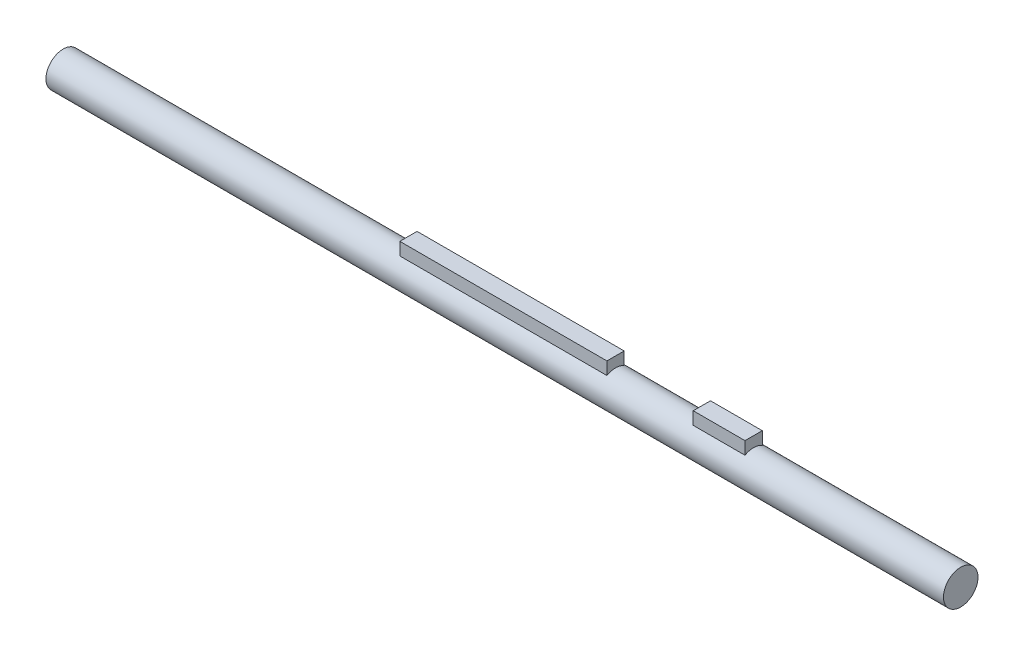
ISO-10303-21;
HEADER;
FILE_DESCRIPTION(('STEP AP214'),'2;1');
FILE_NAME('part.step','',(''),(''),'','','');
FILE_SCHEMA(('AUTOMOTIVE_DESIGN { 1 0 10303 214 1 1 1 1 }'));
ENDSEC;
DATA;
#1=APPLICATION_CONTEXT('core data for automotive mechanical design processes');
#2=APPLICATION_PROTOCOL_DEFINITION('international standard','automotive_design',2000,#1);
#3=PRODUCT_CONTEXT('',#1,'mechanical');
#4=PRODUCT('Part','Part','',(#3));
#5=PRODUCT_RELATED_PRODUCT_CATEGORY('part','',(#4));
#6=PRODUCT_DEFINITION_FORMATION('','',#4);
#7=PRODUCT_DEFINITION_CONTEXT('part definition',#1,'design');
#8=PRODUCT_DEFINITION('design','',#6,#7);
#9=PRODUCT_DEFINITION_SHAPE('','',#8);
#10=(LENGTH_UNIT() NAMED_UNIT(*) SI_UNIT(.MILLI.,.METRE.));
#11=(NAMED_UNIT(*) PLANE_ANGLE_UNIT() SI_UNIT($,.RADIAN.));
#12=(NAMED_UNIT(*) SI_UNIT($,.STERADIAN.) SOLID_ANGLE_UNIT());
#13=UNCERTAINTY_MEASURE_WITH_UNIT(LENGTH_MEASURE(1.E-05),#10,'distance_accuracy_value','');
#14=(GEOMETRIC_REPRESENTATION_CONTEXT(3) GLOBAL_UNCERTAINTY_ASSIGNED_CONTEXT((#13)) GLOBAL_UNIT_ASSIGNED_CONTEXT((#10,
#11,#12)) REPRESENTATION_CONTEXT('',''));
#15=CARTESIAN_POINT('',(0.,0.,0.));
#16=DIRECTION('',(0.,0.,1.));
#17=DIRECTION('',(1.,0.,0.));
#18=AXIS2_PLACEMENT_3D('',#15,#16,#17);
#19=CARTESIAN_POINT('',(-30.,8.,-2.5));
#20=DIRECTION('',(0.,0.,-1.));
#21=DIRECTION('',(0.,1.,0.));
#22=AXIS2_PLACEMENT_3D('',#19,#20,#21);
#23=PLANE('',#22);
#24=DIRECTION('',(1.,0.,0.));
#25=VECTOR('',#24,1.);
#26=CARTESIAN_POINT('',(-30.,8.,-2.5));
#27=LINE('',#26,#25);
#28=CARTESIAN_POINT('',(-30.,8.,-2.5));
#29=VERTEX_POINT('',#28);
#30=CARTESIAN_POINT('',(30.,8.,-2.5));
#31=VERTEX_POINT('',#30);
#32=EDGE_CURVE('E191',#29,#31,#27,.T.);
#33=ORIENTED_EDGE('',*,*,#32,.T.);
#34=DIRECTION('',(0.,-1.,0.));
#35=VECTOR('',#34,1.);
#36=CARTESIAN_POINT('',(30.,4.33012701892219,-2.5));
#37=LINE('',#36,#35);
#38=CARTESIAN_POINT('',(30.,4.33012701892219,-2.5));
#39=VERTEX_POINT('',#38);
#40=EDGE_CURVE('E177',#31,#39,#37,.T.);
#41=ORIENTED_EDGE('',*,*,#40,.T.);
#42=DIRECTION('',(1.,0.,0.));
#43=VECTOR('',#42,1.);
#44=CARTESIAN_POINT('',(-130.,4.33012701892219,-2.5));
#45=LINE('',#44,#43);
#46=CARTESIAN_POINT('',(-30.,4.33012701892219,-2.5));
#47=VERTEX_POINT('',#46);
#48=EDGE_CURVE('E71',#39,#47,#45,.F.);
#49=ORIENTED_EDGE('',*,*,#48,.T.);
#50=DIRECTION('',(0.,1.,0.));
#51=VECTOR('',#50,1.);
#52=CARTESIAN_POINT('',(-30.,8.,-2.5));
#53=LINE('',#52,#51);
#54=EDGE_CURVE('E180',#47,#29,#53,.T.);
#55=ORIENTED_EDGE('',*,*,#54,.T.);
#56=EDGE_LOOP('',(#33,#41,#49,#55));
#57=FACE_BOUND('',#56,.T.);
#58=ADVANCED_FACE('F47',(#57),#23,.T.);
#59=CARTESIAN_POINT('',(-30.,8.,2.5));
#60=DIRECTION('',(0.,0.,1.));
#61=DIRECTION('',(0.,-1.,0.));
#62=AXIS2_PLACEMENT_3D('',#59,#60,#61);
#63=PLANE('',#62);
#64=DIRECTION('',(1.,0.,0.));
#65=VECTOR('',#64,1.);
#66=CARTESIAN_POINT('',(-130.,4.33012701892219,2.5));
#67=LINE('',#66,#65);
#68=CARTESIAN_POINT('',(-30.,4.33012701892219,2.5));
#69=VERTEX_POINT('',#68);
#70=CARTESIAN_POINT('',(30.,4.33012701892219,2.5));
#71=VERTEX_POINT('',#70);
#72=EDGE_CURVE('E196',#69,#71,#67,.T.);
#73=ORIENTED_EDGE('',*,*,#72,.T.);
#74=DIRECTION('',(0.,1.,0.));
#75=VECTOR('',#74,1.);
#76=CARTESIAN_POINT('',(30.,8.,2.5));
#77=LINE('',#76,#75);
#78=CARTESIAN_POINT('',(30.,8.,2.5));
#79=VERTEX_POINT('',#78);
#80=EDGE_CURVE('E170',#71,#79,#77,.T.);
#81=ORIENTED_EDGE('',*,*,#80,.T.);
#82=DIRECTION('',(1.,0.,0.));
#83=VECTOR('',#82,1.);
#84=CARTESIAN_POINT('',(-30.,8.,2.5));
#85=LINE('',#84,#83);
#86=CARTESIAN_POINT('',(-30.,8.,2.5));
#87=VERTEX_POINT('',#86);
#88=EDGE_CURVE('E192',#87,#79,#85,.T.);
#89=ORIENTED_EDGE('',*,*,#88,.F.);
#90=DIRECTION('',(0.,-1.,0.));
#91=VECTOR('',#90,1.);
#92=CARTESIAN_POINT('',(-30.,8.,2.5));
#93=LINE('',#92,#91);
#94=EDGE_CURVE('E187',#87,#69,#93,.T.);
#95=ORIENTED_EDGE('',*,*,#94,.T.);
#96=EDGE_LOOP('',(#73,#81,#89,#95));
#97=FACE_BOUND('',#96,.T.);
#98=ADVANCED_FACE('F225',(#97),#63,.T.);
#99=CARTESIAN_POINT('',(-30.,8.,2.5));
#100=DIRECTION('',(0.,1.,0.));
#101=DIRECTION('',(0.,0.,1.));
#102=AXIS2_PLACEMENT_3D('',#99,#100,#101);
#103=PLANE('',#102);
#104=ORIENTED_EDGE('',*,*,#88,.T.);
#105=DIRECTION('',(0.,0.,-1.));
#106=VECTOR('',#105,1.);
#107=CARTESIAN_POINT('',(30.,8.,-2.5));
#108=LINE('',#107,#106);
#109=EDGE_CURVE('E136',#79,#31,#108,.T.);
#110=ORIENTED_EDGE('',*,*,#109,.T.);
#111=ORIENTED_EDGE('',*,*,#32,.F.);
#112=DIRECTION('',(0.,0.,1.));
#113=VECTOR('',#112,1.);
#114=CARTESIAN_POINT('',(-30.,8.,2.5));
#115=LINE('',#114,#113);
#116=EDGE_CURVE('E183',#29,#87,#115,.T.);
#117=ORIENTED_EDGE('',*,*,#116,.T.);
#118=EDGE_LOOP('',(#104,#110,#111,#117));
#119=FACE_BOUND('',#118,.T.);
#120=ADVANCED_FACE('F223',(#119),#103,.T.);
#121=CARTESIAN_POINT('',(-130.,0.,0.));
#122=DIRECTION('',(1.,0.,0.));
#123=DIRECTION('',(0.,0.,-1.));
#124=AXIS2_PLACEMENT_3D('',#121,#122,#123);
#125=CYLINDRICAL_SURFACE('',#124,5.);
#126=CARTESIAN_POINT('',(70.,0.,0.));
#127=DIRECTION('',(1.,0.,0.));
#128=DIRECTION('',(0.,0.,-1.));
#129=AXIS2_PLACEMENT_3D('',#126,#127,#128);
#130=CIRCLE('',#129,5.);
#131=CARTESIAN_POINT('',(70.,4.33012701892219,2.5));
#132=VERTEX_POINT('',#131);
#133=CARTESIAN_POINT('',(70.,4.33012701892219,-2.5));
#134=VERTEX_POINT('',#133);
#135=EDGE_CURVE('E117',#132,#134,#130,.F.);
#136=ORIENTED_EDGE('',*,*,#135,.F.);
#137=DIRECTION('',(-1.,0.,0.));
#138=VECTOR('',#137,1.);
#139=CARTESIAN_POINT('',(70.,4.33012701892219,2.5));
#140=LINE('',#139,#138);
#141=CARTESIAN_POINT('',(55.,4.33012701892219,2.5));
#142=VERTEX_POINT('',#141);
#143=EDGE_CURVE('E129',#132,#142,#140,.T.);
#144=ORIENTED_EDGE('',*,*,#143,.T.);
#145=CARTESIAN_POINT('',(55.,0.,0.));
#146=DIRECTION('',(1.,0.,0.));
#147=DIRECTION('',(0.,0.,-1.));
#148=AXIS2_PLACEMENT_3D('',#145,#146,#147);
#149=CIRCLE('',#148,5.);
#150=CARTESIAN_POINT('',(55.,4.33012701892219,-2.5));
#151=VERTEX_POINT('',#150);
#152=EDGE_CURVE('E152',#142,#151,#149,.F.);
#153=ORIENTED_EDGE('',*,*,#152,.T.);
#154=DIRECTION('',(-1.,0.,0.));
#155=VECTOR('',#154,1.);
#156=CARTESIAN_POINT('',(70.,4.33012701892219,-2.5));
#157=LINE('',#156,#155);
#158=EDGE_CURVE('E137',#134,#151,#157,.T.);
#159=ORIENTED_EDGE('',*,*,#158,.F.);
#160=EDGE_LOOP('',(#136,#144,#153,#159));
#161=FACE_BOUND('',#160,.T.);
#162=ORIENTED_EDGE('',*,*,#48,.F.);
#163=CARTESIAN_POINT('',(30.,0.,0.));
#164=DIRECTION('',(1.,0.,0.));
#165=DIRECTION('',(0.,0.,-1.));
#166=AXIS2_PLACEMENT_3D('',#163,#164,#165);
#167=CIRCLE('',#166,5.);
#168=EDGE_CURVE('E174',#39,#71,#167,.T.);
#169=ORIENTED_EDGE('',*,*,#168,.T.);
#170=ORIENTED_EDGE('',*,*,#72,.F.);
#171=CARTESIAN_POINT('',(-30.,0.,0.));
#172=DIRECTION('',(1.,0.,0.));
#173=DIRECTION('',(0.,0.,-1.));
#174=AXIS2_PLACEMENT_3D('',#171,#172,#173);
#175=CIRCLE('',#174,5.);
#176=EDGE_CURVE('E12',#69,#47,#175,.F.);
#177=ORIENTED_EDGE('',*,*,#176,.T.);
#178=EDGE_LOOP('',(#162,#169,#170,#177));
#179=FACE_BOUND('',#178,.T.);
#180=CARTESIAN_POINT('',(130.,0.,0.));
#181=DIRECTION('',(1.,0.,0.));
#182=DIRECTION('',(0.,0.,-1.));
#183=AXIS2_PLACEMENT_3D('',#180,#181,#182);
#184=CIRCLE('',#183,5.);
#185=CARTESIAN_POINT('',(130.,0.,-5.));
#186=VERTEX_POINT('',#185);
#187=EDGE_CURVE('E205',#186,#186,#184,.T.);
#188=ORIENTED_EDGE('',*,*,#187,.F.);
#189=EDGE_LOOP('',(#188));
#190=FACE_BOUND('',#189,.T.);
#191=CARTESIAN_POINT('',(-130.,0.,0.));
#192=DIRECTION('',(1.,0.,0.));
#193=DIRECTION('',(0.,0.,-1.));
#194=AXIS2_PLACEMENT_3D('',#191,#192,#193);
#195=CIRCLE('',#194,5.);
#196=CARTESIAN_POINT('',(-130.,0.,-5.));
#197=VERTEX_POINT('',#196);
#198=EDGE_CURVE('E56',#197,#197,#195,.T.);
#199=ORIENTED_EDGE('',*,*,#198,.T.);
#200=EDGE_LOOP('',(#199));
#201=FACE_BOUND('',#200,.T.);
#202=ADVANCED_FACE('F49',(#161,#179,#190,#201),#125,.T.);
#203=CARTESIAN_POINT('',(-130.,0.,0.));
#204=DIRECTION('',(1.,0.,0.));
#205=DIRECTION('',(0.,0.,-1.));
#206=AXIS2_PLACEMENT_3D('',#203,#204,#205);
#207=PLANE('',#206);
#208=ORIENTED_EDGE('',*,*,#198,.F.);
#209=EDGE_LOOP('',(#208));
#210=FACE_BOUND('',#209,.T.);
#211=ADVANCED_FACE('F213',(#210),#207,.F.);
#212=CARTESIAN_POINT('',(130.,0.,0.));
#213=DIRECTION('',(1.,0.,0.));
#214=DIRECTION('',(0.,0.,-1.));
#215=AXIS2_PLACEMENT_3D('',#212,#213,#214);
#216=PLANE('',#215);
#217=ORIENTED_EDGE('',*,*,#187,.T.);
#218=EDGE_LOOP('',(#217));
#219=FACE_BOUND('',#218,.T.);
#220=ADVANCED_FACE('F215',(#219),#216,.T.);
#221=CARTESIAN_POINT('',(-30.,0.,0.));
#222=DIRECTION('',(1.,0.,0.));
#223=DIRECTION('',(0.,0.,-1.));
#224=AXIS2_PLACEMENT_3D('',#221,#222,#223);
#225=PLANE('',#224);
#226=ORIENTED_EDGE('',*,*,#176,.F.);
#227=ORIENTED_EDGE('',*,*,#94,.F.);
#228=ORIENTED_EDGE('',*,*,#116,.F.);
#229=ORIENTED_EDGE('',*,*,#54,.F.);
#230=EDGE_LOOP('',(#226,#227,#228,#229));
#231=FACE_BOUND('',#230,.T.);
#232=ADVANCED_FACE('F220',(#231),#225,.F.);
#233=CARTESIAN_POINT('',(30.,0.,0.));
#234=DIRECTION('',(1.,0.,0.));
#235=DIRECTION('',(0.,0.,-1.));
#236=AXIS2_PLACEMENT_3D('',#233,#234,#235);
#237=PLANE('',#236);
#238=ORIENTED_EDGE('',*,*,#168,.F.);
#239=ORIENTED_EDGE('',*,*,#40,.F.);
#240=ORIENTED_EDGE('',*,*,#109,.F.);
#241=ORIENTED_EDGE('',*,*,#80,.F.);
#242=EDGE_LOOP('',(#238,#239,#240,#241));
#243=FACE_BOUND('',#242,.T.);
#244=ADVANCED_FACE('F238',(#243),#237,.T.);
#245=CARTESIAN_POINT('',(70.,0.,2.5));
#246=DIRECTION('',(0.,0.,-1.));
#247=DIRECTION('',(0.,1.,0.));
#248=AXIS2_PLACEMENT_3D('',#245,#246,#247);
#249=PLANE('',#248);
#250=DIRECTION('',(0.,-1.,0.));
#251=VECTOR('',#250,1.);
#252=CARTESIAN_POINT('',(55.,0.,2.5));
#253=LINE('',#252,#251);
#254=CARTESIAN_POINT('',(55.,8.,2.5));
#255=VERTEX_POINT('',#254);
#256=EDGE_CURVE('E132',#255,#142,#253,.T.);
#257=ORIENTED_EDGE('',*,*,#256,.T.);
#258=ORIENTED_EDGE('',*,*,#143,.F.);
#259=DIRECTION('',(0.,-1.,0.));
#260=VECTOR('',#259,1.);
#261=CARTESIAN_POINT('',(70.,0.,2.5));
#262=LINE('',#261,#260);
#263=CARTESIAN_POINT('',(70.,8.,2.5));
#264=VERTEX_POINT('',#263);
#265=EDGE_CURVE('E113',#264,#132,#262,.T.);
#266=ORIENTED_EDGE('',*,*,#265,.F.);
#267=DIRECTION('',(-1.,0.,0.));
#268=VECTOR('',#267,1.);
#269=CARTESIAN_POINT('',(70.,8.,2.5));
#270=LINE('',#269,#268);
#271=EDGE_CURVE('E149',#264,#255,#270,.T.);
#272=ORIENTED_EDGE('',*,*,#271,.T.);
#273=EDGE_LOOP('',(#257,#258,#266,#272));
#274=FACE_BOUND('',#273,.T.);
#275=ADVANCED_FACE('F130',(#274),#249,.F.);
#276=CARTESIAN_POINT('',(70.,0.,-2.5));
#277=DIRECTION('',(0.,0.,1.));
#278=DIRECTION('',(0.,-1.,0.));
#279=AXIS2_PLACEMENT_3D('',#276,#277,#278);
#280=PLANE('',#279);
#281=DIRECTION('',(0.,1.,0.));
#282=VECTOR('',#281,1.);
#283=CARTESIAN_POINT('',(55.,0.,-2.5));
#284=LINE('',#283,#282);
#285=CARTESIAN_POINT('',(55.,8.,-2.5));
#286=VERTEX_POINT('',#285);
#287=EDGE_CURVE('E63',#151,#286,#284,.T.);
#288=ORIENTED_EDGE('',*,*,#287,.T.);
#289=DIRECTION('',(-1.,0.,0.));
#290=VECTOR('',#289,1.);
#291=CARTESIAN_POINT('',(70.,8.,-2.5));
#292=LINE('',#291,#290);
#293=CARTESIAN_POINT('',(70.,8.,-2.5));
#294=VERTEX_POINT('',#293);
#295=EDGE_CURVE('E161',#294,#286,#292,.T.);
#296=ORIENTED_EDGE('',*,*,#295,.F.);
#297=DIRECTION('',(0.,1.,0.));
#298=VECTOR('',#297,1.);
#299=CARTESIAN_POINT('',(70.,0.,-2.5));
#300=LINE('',#299,#298);
#301=EDGE_CURVE('E142',#134,#294,#300,.T.);
#302=ORIENTED_EDGE('',*,*,#301,.F.);
#303=ORIENTED_EDGE('',*,*,#158,.T.);
#304=EDGE_LOOP('',(#288,#296,#302,#303));
#305=FACE_BOUND('',#304,.T.);
#306=ADVANCED_FACE('F245',(#305),#280,.F.);
#307=CARTESIAN_POINT('',(70.,8.,0.));
#308=DIRECTION('',(0.,-1.,0.));
#309=DIRECTION('',(0.,0.,-1.));
#310=AXIS2_PLACEMENT_3D('',#307,#308,#309);
#311=PLANE('',#310);
#312=DIRECTION('',(0.,0.,1.));
#313=VECTOR('',#312,1.);
#314=CARTESIAN_POINT('',(55.,8.,0.));
#315=LINE('',#314,#313);
#316=EDGE_CURVE('E125',#286,#255,#315,.T.);
#317=ORIENTED_EDGE('',*,*,#316,.T.);
#318=ORIENTED_EDGE('',*,*,#271,.F.);
#319=DIRECTION('',(0.,0.,1.));
#320=VECTOR('',#319,1.);
#321=CARTESIAN_POINT('',(70.,8.,0.));
#322=LINE('',#321,#320);
#323=EDGE_CURVE('E120',#294,#264,#322,.T.);
#324=ORIENTED_EDGE('',*,*,#323,.F.);
#325=ORIENTED_EDGE('',*,*,#295,.T.);
#326=EDGE_LOOP('',(#317,#318,#324,#325));
#327=FACE_BOUND('',#326,.T.);
#328=ADVANCED_FACE('F248',(#327),#311,.F.);
#329=CARTESIAN_POINT('',(70.,0.,0.));
#330=DIRECTION('',(1.,0.,0.));
#331=DIRECTION('',(0.,0.,-1.));
#332=AXIS2_PLACEMENT_3D('',#329,#330,#331);
#333=PLANE('',#332);
#334=ORIENTED_EDGE('',*,*,#265,.T.);
#335=ORIENTED_EDGE('',*,*,#135,.T.);
#336=ORIENTED_EDGE('',*,*,#301,.T.);
#337=ORIENTED_EDGE('',*,*,#323,.T.);
#338=EDGE_LOOP('',(#334,#335,#336,#337));
#339=FACE_BOUND('',#338,.T.);
#340=ADVANCED_FACE('F115',(#339),#333,.T.);
#341=CARTESIAN_POINT('',(55.,0.,0.));
#342=DIRECTION('',(1.,0.,0.));
#343=DIRECTION('',(0.,0.,-1.));
#344=AXIS2_PLACEMENT_3D('',#341,#342,#343);
#345=PLANE('',#344);
#346=ORIENTED_EDGE('',*,*,#256,.F.);
#347=ORIENTED_EDGE('',*,*,#316,.F.);
#348=ORIENTED_EDGE('',*,*,#287,.F.);
#349=ORIENTED_EDGE('',*,*,#152,.F.);
#350=EDGE_LOOP('',(#346,#347,#348,#349));
#351=FACE_BOUND('',#350,.T.);
#352=ADVANCED_FACE('F253',(#351),#345,.F.);
#353=CLOSED_SHELL('',(#58,#98,#120,#202,#211,#220,#232,#244,#275,#306,#328,#340,#352));
#354=MANIFOLD_SOLID_BREP('B2',#353);
#355=ADVANCED_BREP_SHAPE_REPRESENTATION('',(#18,#354),#14);
#356=SHAPE_DEFINITION_REPRESENTATION(#9,#355);
ENDSEC;
END-ISO-10303-21;
